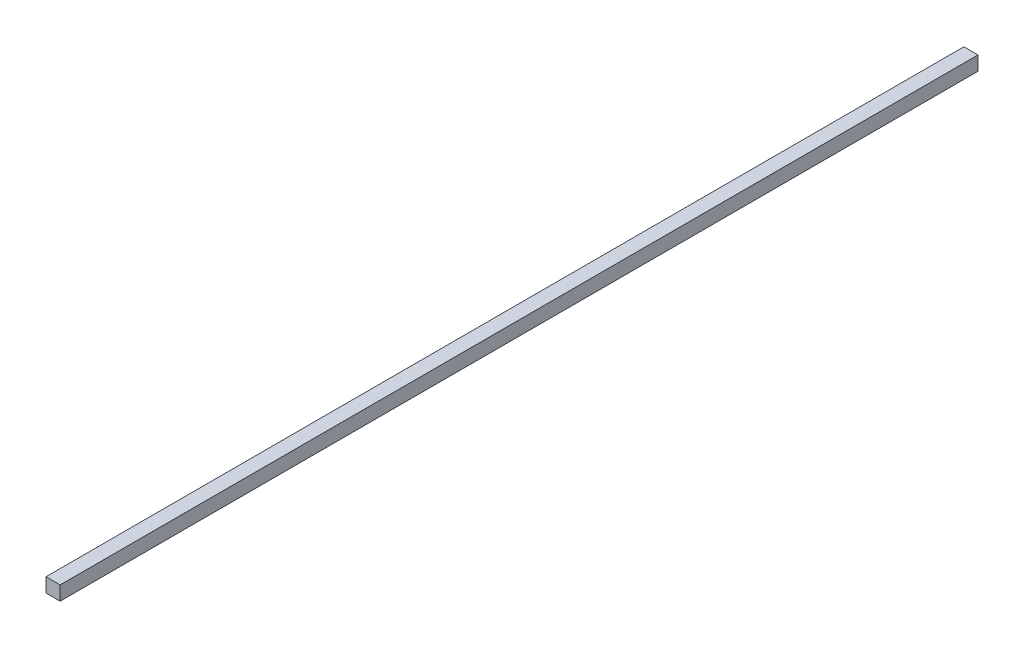
ISO-10303-21;
HEADER;
FILE_DESCRIPTION(('STEP AP214'),'2;1');
FILE_NAME('part.step','',(''),(''),'','','');
FILE_SCHEMA(('AUTOMOTIVE_DESIGN { 1 0 10303 214 1 1 1 1 }'));
ENDSEC;
DATA;
#1=APPLICATION_CONTEXT('core data for automotive mechanical design processes');
#2=APPLICATION_PROTOCOL_DEFINITION('international standard','automotive_design',2000,#1);
#3=PRODUCT_CONTEXT('',#1,'mechanical');
#4=PRODUCT('Part','Part','',(#3));
#5=PRODUCT_RELATED_PRODUCT_CATEGORY('part','',(#4));
#6=PRODUCT_DEFINITION_FORMATION('','',#4);
#7=PRODUCT_DEFINITION_CONTEXT('part definition',#1,'design');
#8=PRODUCT_DEFINITION('design','',#6,#7);
#9=PRODUCT_DEFINITION_SHAPE('','',#8);
#10=(LENGTH_UNIT() NAMED_UNIT(*) SI_UNIT(.MILLI.,.METRE.));
#11=(NAMED_UNIT(*) PLANE_ANGLE_UNIT() SI_UNIT($,.RADIAN.));
#12=(NAMED_UNIT(*) SI_UNIT($,.STERADIAN.) SOLID_ANGLE_UNIT());
#13=UNCERTAINTY_MEASURE_WITH_UNIT(LENGTH_MEASURE(1.E-05),#10,'distance_accuracy_value','');
#14=(GEOMETRIC_REPRESENTATION_CONTEXT(3) GLOBAL_UNCERTAINTY_ASSIGNED_CONTEXT((#13)) GLOBAL_UNIT_ASSIGNED_CONTEXT((#10,
#11,#12)) REPRESENTATION_CONTEXT('',''));
#15=CARTESIAN_POINT('',(0.,0.,0.));
#16=DIRECTION('',(0.,0.,1.));
#17=DIRECTION('',(1.,0.,0.));
#18=AXIS2_PLACEMENT_3D('',#15,#16,#17);
#19=CARTESIAN_POINT('',(10.,10.,1300.));
#20=DIRECTION('',(-1.,0.,0.));
#21=DIRECTION('',(0.,-1.,0.));
#22=AXIS2_PLACEMENT_3D('',#19,#20,#21);
#23=PLANE('',#22);
#24=DIRECTION('',(0.,1.,0.));
#25=VECTOR('',#24,1.);
#26=CARTESIAN_POINT('',(10.,10.,0.));
#27=LINE('',#26,#25);
#28=CARTESIAN_POINT('',(10.,-10.,0.));
#29=VERTEX_POINT('',#28);
#30=CARTESIAN_POINT('',(10.,10.,0.));
#31=VERTEX_POINT('',#30);
#32=EDGE_CURVE('E98',#29,#31,#27,.T.);
#33=ORIENTED_EDGE('',*,*,#32,.T.);
#34=DIRECTION('',(0.,0.,-1.));
#35=VECTOR('',#34,1.);
#36=CARTESIAN_POINT('',(10.,10.,1300.));
#37=LINE('',#36,#35);
#38=CARTESIAN_POINT('',(10.,10.,1300.));
#39=VERTEX_POINT('',#38);
#40=EDGE_CURVE('E11',#39,#31,#37,.T.);
#41=ORIENTED_EDGE('',*,*,#40,.F.);
#42=DIRECTION('',(0.,1.,0.));
#43=VECTOR('',#42,1.);
#44=CARTESIAN_POINT('',(10.,10.,1300.));
#45=LINE('',#44,#43);
#46=CARTESIAN_POINT('',(10.,-10.,1300.));
#47=VERTEX_POINT('',#46);
#48=EDGE_CURVE('E86',#47,#39,#45,.T.);
#49=ORIENTED_EDGE('',*,*,#48,.F.);
#50=DIRECTION('',(0.,0.,-1.));
#51=VECTOR('',#50,1.);
#52=CARTESIAN_POINT('',(10.,-10.,1300.));
#53=LINE('',#52,#51);
#54=EDGE_CURVE('E94',#47,#29,#53,.T.);
#55=ORIENTED_EDGE('',*,*,#54,.T.);
#56=EDGE_LOOP('',(#33,#41,#49,#55));
#57=FACE_BOUND('',#56,.T.);
#58=ADVANCED_FACE('F35',(#57),#23,.F.);
#59=CARTESIAN_POINT('',(-10.,10.,1300.));
#60=DIRECTION('',(0.,-1.,0.));
#61=DIRECTION('',(0.,0.,-1.));
#62=AXIS2_PLACEMENT_3D('',#59,#60,#61);
#63=PLANE('',#62);
#64=DIRECTION('',(-1.,0.,0.));
#65=VECTOR('',#64,1.);
#66=CARTESIAN_POINT('',(-10.,10.,0.));
#67=LINE('',#66,#65);
#68=CARTESIAN_POINT('',(-10.,10.,0.));
#69=VERTEX_POINT('',#68);
#70=EDGE_CURVE('E90',#31,#69,#67,.T.);
#71=ORIENTED_EDGE('',*,*,#70,.T.);
#72=DIRECTION('',(0.,0.,-1.));
#73=VECTOR('',#72,1.);
#74=CARTESIAN_POINT('',(-10.,10.,1300.));
#75=LINE('',#74,#73);
#76=CARTESIAN_POINT('',(-10.,10.,1300.));
#77=VERTEX_POINT('',#76);
#78=EDGE_CURVE('E43',#77,#69,#75,.T.);
#79=ORIENTED_EDGE('',*,*,#78,.F.);
#80=DIRECTION('',(-1.,0.,0.));
#81=VECTOR('',#80,1.);
#82=CARTESIAN_POINT('',(-10.,10.,1300.));
#83=LINE('',#82,#81);
#84=EDGE_CURVE('E81',#39,#77,#83,.T.);
#85=ORIENTED_EDGE('',*,*,#84,.F.);
#86=ORIENTED_EDGE('',*,*,#40,.T.);
#87=EDGE_LOOP('',(#71,#79,#85,#86));
#88=FACE_BOUND('',#87,.T.);
#89=ADVANCED_FACE('F89',(#88),#63,.F.);
#90=CARTESIAN_POINT('',(-10.,10.,1300.));
#91=DIRECTION('',(1.,0.,0.));
#92=DIRECTION('',(0.,1.,0.));
#93=AXIS2_PLACEMENT_3D('',#90,#91,#92);
#94=PLANE('',#93);
#95=DIRECTION('',(0.,-1.,0.));
#96=VECTOR('',#95,1.);
#97=CARTESIAN_POINT('',(-10.,10.,0.));
#98=LINE('',#97,#96);
#99=CARTESIAN_POINT('',(-10.,-10.,0.));
#100=VERTEX_POINT('',#99);
#101=EDGE_CURVE('E68',#69,#100,#98,.T.);
#102=ORIENTED_EDGE('',*,*,#101,.T.);
#103=DIRECTION('',(0.,0.,-1.));
#104=VECTOR('',#103,1.);
#105=CARTESIAN_POINT('',(-10.,-10.,1300.));
#106=LINE('',#105,#104);
#107=CARTESIAN_POINT('',(-10.,-10.,1300.));
#108=VERTEX_POINT('',#107);
#109=EDGE_CURVE('E91',#108,#100,#106,.T.);
#110=ORIENTED_EDGE('',*,*,#109,.F.);
#111=DIRECTION('',(0.,-1.,0.));
#112=VECTOR('',#111,1.);
#113=CARTESIAN_POINT('',(-10.,10.,1300.));
#114=LINE('',#113,#112);
#115=EDGE_CURVE('E84',#77,#108,#114,.T.);
#116=ORIENTED_EDGE('',*,*,#115,.F.);
#117=ORIENTED_EDGE('',*,*,#78,.T.);
#118=EDGE_LOOP('',(#102,#110,#116,#117));
#119=FACE_BOUND('',#118,.T.);
#120=ADVANCED_FACE('F92',(#119),#94,.F.);
#121=CARTESIAN_POINT('',(-10.,-10.,1300.));
#122=DIRECTION('',(0.,1.,0.));
#123=DIRECTION('',(0.,0.,1.));
#124=AXIS2_PLACEMENT_3D('',#121,#122,#123);
#125=PLANE('',#124);
#126=DIRECTION('',(1.,0.,0.));
#127=VECTOR('',#126,1.);
#128=CARTESIAN_POINT('',(-10.,-10.,0.));
#129=LINE('',#128,#127);
#130=EDGE_CURVE('E74',#100,#29,#129,.T.);
#131=ORIENTED_EDGE('',*,*,#130,.T.);
#132=ORIENTED_EDGE('',*,*,#54,.F.);
#133=DIRECTION('',(1.,0.,0.));
#134=VECTOR('',#133,1.);
#135=CARTESIAN_POINT('',(-10.,-10.,1300.));
#136=LINE('',#135,#134);
#137=EDGE_CURVE('E51',#108,#47,#136,.T.);
#138=ORIENTED_EDGE('',*,*,#137,.F.);
#139=ORIENTED_EDGE('',*,*,#109,.T.);
#140=EDGE_LOOP('',(#131,#132,#138,#139));
#141=FACE_BOUND('',#140,.T.);
#142=ADVANCED_FACE('F105',(#141),#125,.F.);
#143=CARTESIAN_POINT('',(0.,0.,1300.));
#144=DIRECTION('',(0.,0.,1.));
#145=DIRECTION('',(1.,0.,0.));
#146=AXIS2_PLACEMENT_3D('',#143,#144,#145);
#147=PLANE('',#146);
#148=ORIENTED_EDGE('',*,*,#48,.T.);
#149=ORIENTED_EDGE('',*,*,#84,.T.);
#150=ORIENTED_EDGE('',*,*,#115,.T.);
#151=ORIENTED_EDGE('',*,*,#137,.T.);
#152=EDGE_LOOP('',(#148,#149,#150,#151));
#153=FACE_BOUND('',#152,.T.);
#154=ADVANCED_FACE('F82',(#153),#147,.T.);
#155=CARTESIAN_POINT('',(0.,0.,0.));
#156=DIRECTION('',(0.,0.,1.));
#157=DIRECTION('',(1.,0.,0.));
#158=AXIS2_PLACEMENT_3D('',#155,#156,#157);
#159=PLANE('',#158);
#160=ORIENTED_EDGE('',*,*,#32,.F.);
#161=ORIENTED_EDGE('',*,*,#130,.F.);
#162=ORIENTED_EDGE('',*,*,#101,.F.);
#163=ORIENTED_EDGE('',*,*,#70,.F.);
#164=EDGE_LOOP('',(#160,#161,#162,#163));
#165=FACE_BOUND('',#164,.T.);
#166=ADVANCED_FACE('F108',(#165),#159,.F.);
#167=CLOSED_SHELL('',(#58,#89,#120,#142,#154,#166));
#168=MANIFOLD_SOLID_BREP('B2',#167);
#169=ADVANCED_BREP_SHAPE_REPRESENTATION('',(#18,#168),#14);
#170=SHAPE_DEFINITION_REPRESENTATION(#9,#169);
ENDSEC;
END-ISO-10303-21;
